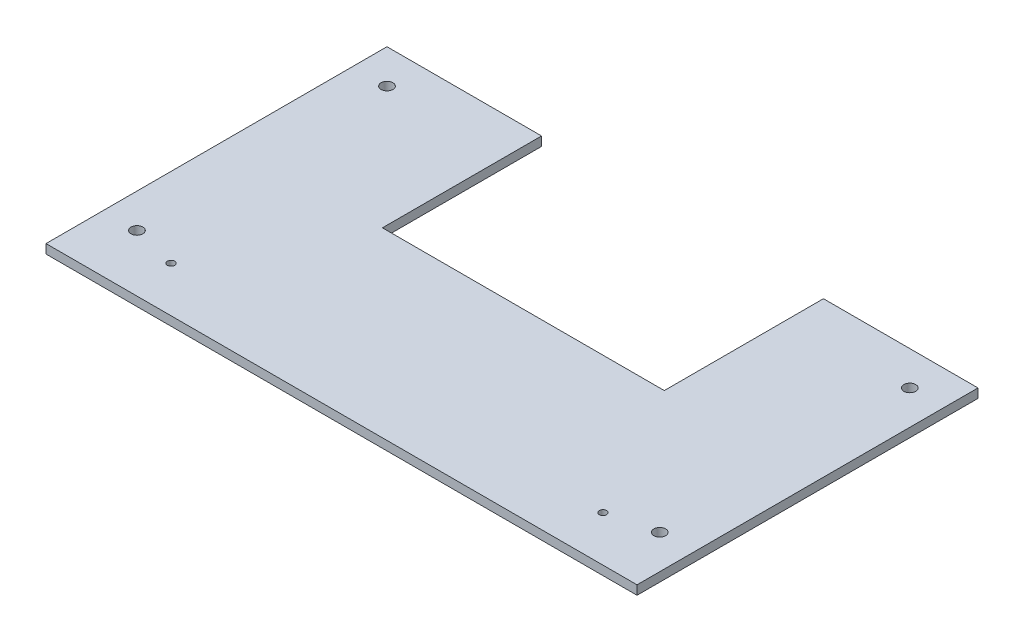
ISO-10303-21;
HEADER;
FILE_DESCRIPTION(('STEP AP214'),'2;1');
FILE_NAME('part.step','',(''),(''),'','','');
FILE_SCHEMA(('AUTOMOTIVE_DESIGN { 1 0 10303 214 1 1 1 1 }'));
ENDSEC;
DATA;
#1=APPLICATION_CONTEXT('core data for automotive mechanical design processes');
#2=APPLICATION_PROTOCOL_DEFINITION('international standard','automotive_design',2000,#1);
#3=PRODUCT_CONTEXT('',#1,'mechanical');
#4=PRODUCT('Part','Part','',(#3));
#5=PRODUCT_RELATED_PRODUCT_CATEGORY('part','',(#4));
#6=PRODUCT_DEFINITION_FORMATION('','',#4);
#7=PRODUCT_DEFINITION_CONTEXT('part definition',#1,'design');
#8=PRODUCT_DEFINITION('design','',#6,#7);
#9=PRODUCT_DEFINITION_SHAPE('','',#8);
#10=(LENGTH_UNIT() NAMED_UNIT(*) SI_UNIT(.MILLI.,.METRE.));
#11=(NAMED_UNIT(*) PLANE_ANGLE_UNIT() SI_UNIT($,.RADIAN.));
#12=(NAMED_UNIT(*) SI_UNIT($,.STERADIAN.) SOLID_ANGLE_UNIT());
#13=UNCERTAINTY_MEASURE_WITH_UNIT(LENGTH_MEASURE(1.E-05),#10,'distance_accuracy_value','');
#14=(GEOMETRIC_REPRESENTATION_CONTEXT(3) GLOBAL_UNCERTAINTY_ASSIGNED_CONTEXT((#13)) GLOBAL_UNIT_ASSIGNED_CONTEXT((#10,
#11,#12)) REPRESENTATION_CONTEXT('',''));
#15=CARTESIAN_POINT('',(0.,0.,0.));
#16=DIRECTION('',(0.,0.,1.));
#17=DIRECTION('',(1.,0.,0.));
#18=AXIS2_PLACEMENT_3D('',#15,#16,#17);
#19=CARTESIAN_POINT('',(-130.,4.,-75.));
#20=DIRECTION('',(0.,0.,1.));
#21=DIRECTION('',(1.,0.,0.));
#22=AXIS2_PLACEMENT_3D('',#19,#20,#21);
#23=PLANE('',#22);
#24=DIRECTION('',(-1.,0.,0.));
#25=VECTOR('',#24,1.);
#26=CARTESIAN_POINT('',(-130.,4.,-75.));
#27=LINE('',#26,#25);
#28=CARTESIAN_POINT('',(-62.,4.,-75.));
#29=VERTEX_POINT('',#28);
#30=CARTESIAN_POINT('',(-130.,4.,-75.));
#31=VERTEX_POINT('',#30);
#32=EDGE_CURVE('E174',#29,#31,#27,.T.);
#33=ORIENTED_EDGE('',*,*,#32,.F.);
#34=DIRECTION('',(0.,1.,0.));
#35=VECTOR('',#34,1.);
#36=CARTESIAN_POINT('',(-62.,0.,-75.));
#37=LINE('',#36,#35);
#38=CARTESIAN_POINT('',(-62.,0.,-75.));
#39=VERTEX_POINT('',#38);
#40=EDGE_CURVE('E162',#39,#29,#37,.T.);
#41=ORIENTED_EDGE('',*,*,#40,.F.);
#42=DIRECTION('',(-1.,0.,0.));
#43=VECTOR('',#42,1.);
#44=CARTESIAN_POINT('',(-130.,0.,-75.));
#45=LINE('',#44,#43);
#46=CARTESIAN_POINT('',(-130.,0.,-75.));
#47=VERTEX_POINT('',#46);
#48=EDGE_CURVE('E144',#39,#47,#45,.T.);
#49=ORIENTED_EDGE('',*,*,#48,.T.);
#50=DIRECTION('',(0.,-1.,0.));
#51=VECTOR('',#50,1.);
#52=CARTESIAN_POINT('',(-130.,4.,-75.));
#53=LINE('',#52,#51);
#54=EDGE_CURVE('E54',#31,#47,#53,.T.);
#55=ORIENTED_EDGE('',*,*,#54,.F.);
#56=EDGE_LOOP('',(#33,#41,#49,#55));
#57=FACE_BOUND('',#56,.T.);
#58=ADVANCED_FACE('F44',(#57),#23,.F.);
#59=CARTESIAN_POINT('',(130.,4.,75.));
#60=DIRECTION('',(-1.,0.,0.));
#61=DIRECTION('',(0.,0.,1.));
#62=AXIS2_PLACEMENT_3D('',#59,#60,#61);
#63=PLANE('',#62);
#64=DIRECTION('',(0.,0.,-1.));
#65=VECTOR('',#64,1.);
#66=CARTESIAN_POINT('',(130.,0.,75.));
#67=LINE('',#66,#65);
#68=CARTESIAN_POINT('',(130.,0.,75.));
#69=VERTEX_POINT('',#68);
#70=CARTESIAN_POINT('',(130.,0.,-75.));
#71=VERTEX_POINT('',#70);
#72=EDGE_CURVE('E165',#69,#71,#67,.T.);
#73=ORIENTED_EDGE('',*,*,#72,.T.);
#74=DIRECTION('',(0.,-1.,0.));
#75=VECTOR('',#74,1.);
#76=CARTESIAN_POINT('',(130.,4.,-75.));
#77=LINE('',#76,#75);
#78=CARTESIAN_POINT('',(130.,4.,-75.));
#79=VERTEX_POINT('',#78);
#80=EDGE_CURVE('E11',#79,#71,#77,.T.);
#81=ORIENTED_EDGE('',*,*,#80,.F.);
#82=DIRECTION('',(0.,0.,-1.));
#83=VECTOR('',#82,1.);
#84=CARTESIAN_POINT('',(130.,4.,75.));
#85=LINE('',#84,#83);
#86=CARTESIAN_POINT('',(130.,4.,75.));
#87=VERTEX_POINT('',#86);
#88=EDGE_CURVE('E171',#87,#79,#85,.T.);
#89=ORIENTED_EDGE('',*,*,#88,.F.);
#90=DIRECTION('',(0.,-1.,0.));
#91=VECTOR('',#90,1.);
#92=CARTESIAN_POINT('',(130.,4.,75.));
#93=LINE('',#92,#91);
#94=EDGE_CURVE('E182',#87,#69,#93,.T.);
#95=ORIENTED_EDGE('',*,*,#94,.T.);
#96=EDGE_LOOP('',(#73,#81,#89,#95));
#97=FACE_BOUND('',#96,.T.);
#98=ADVANCED_FACE('F46',(#97),#63,.F.);
#99=CARTESIAN_POINT('',(62.,0.,-75.));
#100=VERTEX_POINT('',#99);
#101=EDGE_CURVE('E186',#71,#100,#45,.T.);
#102=ORIENTED_EDGE('',*,*,#101,.T.);
#103=DIRECTION('',(0.,1.,0.));
#104=VECTOR('',#103,1.);
#105=CARTESIAN_POINT('',(62.,0.,-75.));
#106=LINE('',#105,#104);
#107=CARTESIAN_POINT('',(62.,4.,-75.));
#108=VERTEX_POINT('',#107);
#109=EDGE_CURVE('E166',#100,#108,#106,.T.);
#110=ORIENTED_EDGE('',*,*,#109,.T.);
#111=EDGE_CURVE('E99',#79,#108,#27,.T.);
#112=ORIENTED_EDGE('',*,*,#111,.F.);
#113=ORIENTED_EDGE('',*,*,#80,.T.);
#114=EDGE_LOOP('',(#102,#110,#112,#113));
#115=FACE_BOUND('',#114,.T.);
#116=ADVANCED_FACE('F271',(#115),#23,.F.);
#117=CARTESIAN_POINT('',(-130.,4.,75.));
#118=DIRECTION('',(1.,0.,0.));
#119=DIRECTION('',(0.,0.,-1.));
#120=AXIS2_PLACEMENT_3D('',#117,#118,#119);
#121=PLANE('',#120);
#122=DIRECTION('',(0.,0.,1.));
#123=VECTOR('',#122,1.);
#124=CARTESIAN_POINT('',(-130.,0.,75.));
#125=LINE('',#124,#123);
#126=CARTESIAN_POINT('',(-130.,0.,75.));
#127=VERTEX_POINT('',#126);
#128=EDGE_CURVE('E190',#47,#127,#125,.T.);
#129=ORIENTED_EDGE('',*,*,#128,.T.);
#130=DIRECTION('',(0.,-1.,0.));
#131=VECTOR('',#130,1.);
#132=CARTESIAN_POINT('',(-130.,4.,75.));
#133=LINE('',#132,#131);
#134=CARTESIAN_POINT('',(-130.,4.,75.));
#135=VERTEX_POINT('',#134);
#136=EDGE_CURVE('E197',#135,#127,#133,.T.);
#137=ORIENTED_EDGE('',*,*,#136,.F.);
#138=DIRECTION('',(0.,0.,1.));
#139=VECTOR('',#138,1.);
#140=CARTESIAN_POINT('',(-130.,4.,75.));
#141=LINE('',#140,#139);
#142=EDGE_CURVE('E177',#31,#135,#141,.T.);
#143=ORIENTED_EDGE('',*,*,#142,.F.);
#144=ORIENTED_EDGE('',*,*,#54,.T.);
#145=EDGE_LOOP('',(#129,#137,#143,#144));
#146=FACE_BOUND('',#145,.T.);
#147=ADVANCED_FACE('F280',(#146),#121,.F.);
#148=CARTESIAN_POINT('',(-130.,4.,75.));
#149=DIRECTION('',(0.,0.,-1.));
#150=DIRECTION('',(-1.,0.,0.));
#151=AXIS2_PLACEMENT_3D('',#148,#149,#150);
#152=PLANE('',#151);
#153=DIRECTION('',(1.,0.,0.));
#154=VECTOR('',#153,1.);
#155=CARTESIAN_POINT('',(-130.,0.,75.));
#156=LINE('',#155,#154);
#157=EDGE_CURVE('E92',#127,#69,#156,.T.);
#158=ORIENTED_EDGE('',*,*,#157,.T.);
#159=ORIENTED_EDGE('',*,*,#94,.F.);
#160=DIRECTION('',(1.,0.,0.));
#161=VECTOR('',#160,1.);
#162=CARTESIAN_POINT('',(-130.,4.,75.));
#163=LINE('',#162,#161);
#164=EDGE_CURVE('E71',#135,#87,#163,.T.);
#165=ORIENTED_EDGE('',*,*,#164,.F.);
#166=ORIENTED_EDGE('',*,*,#136,.T.);
#167=EDGE_LOOP('',(#158,#159,#165,#166));
#168=FACE_BOUND('',#167,.T.);
#169=ADVANCED_FACE('F285',(#168),#152,.F.);
#170=CARTESIAN_POINT('',(0.,4.,0.));
#171=DIRECTION('',(0.,-1.,0.));
#172=DIRECTION('',(0.,0.,-1.));
#173=AXIS2_PLACEMENT_3D('',#170,#171,#172);
#174=PLANE('',#173);
#175=CARTESIAN_POINT('',(94.9999999999999,4.,55.));
#176=DIRECTION('',(0.,1.,0.));
#177=DIRECTION('',(0.,0.,1.));
#178=AXIS2_PLACEMENT_3D('',#175,#176,#177);
#179=CIRCLE('',#178,1.60000000000001);
#180=CARTESIAN_POINT('',(94.9999999999999,4.,56.6));
#181=VERTEX_POINT('',#180);
#182=EDGE_CURVE('E205',#181,#181,#179,.T.);
#183=ORIENTED_EDGE('',*,*,#182,.F.);
#184=EDGE_LOOP('',(#183));
#185=FACE_BOUND('',#184,.T.);
#186=CARTESIAN_POINT('',(-95.0000000000001,4.,55.0000000000013));
#187=DIRECTION('',(0.,1.,0.));
#188=DIRECTION('',(0.,0.,1.));
#189=AXIS2_PLACEMENT_3D('',#186,#187,#188);
#190=CIRCLE('',#189,1.60000000000001);
#191=CARTESIAN_POINT('',(-95.0000000000001,4.,56.6000000000013));
#192=VERTEX_POINT('',#191);
#193=EDGE_CURVE('E212',#192,#192,#190,.T.);
#194=ORIENTED_EDGE('',*,*,#193,.F.);
#195=EDGE_LOOP('',(#194));
#196=FACE_BOUND('',#195,.T.);
#197=CARTESIAN_POINT('',(-114.999999999999,4.,50.));
#198=DIRECTION('',(0.,1.,0.));
#199=DIRECTION('',(0.,0.,1.));
#200=AXIS2_PLACEMENT_3D('',#197,#198,#199);
#201=CIRCLE('',#200,2.59999999999999);
#202=CARTESIAN_POINT('',(-114.999999999999,4.,52.6));
#203=VERTEX_POINT('',#202);
#204=EDGE_CURVE('E242',#203,#203,#201,.T.);
#205=ORIENTED_EDGE('',*,*,#204,.F.);
#206=EDGE_LOOP('',(#205));
#207=FACE_BOUND('',#206,.T.);
#208=CARTESIAN_POINT('',(115.000000000001,4.,50.));
#209=DIRECTION('',(0.,1.,0.));
#210=DIRECTION('',(0.,0.,1.));
#211=AXIS2_PLACEMENT_3D('',#208,#209,#210);
#212=CIRCLE('',#211,2.59999999999999);
#213=CARTESIAN_POINT('',(115.000000000001,4.,52.6));
#214=VERTEX_POINT('',#213);
#215=EDGE_CURVE('E235',#214,#214,#212,.T.);
#216=ORIENTED_EDGE('',*,*,#215,.F.);
#217=EDGE_LOOP('',(#216));
#218=FACE_BOUND('',#217,.T.);
#219=CARTESIAN_POINT('',(115.,4.,-60.));
#220=DIRECTION('',(0.,1.,0.));
#221=DIRECTION('',(0.,0.,1.));
#222=AXIS2_PLACEMENT_3D('',#219,#220,#221);
#223=CIRCLE('',#222,2.59999999999999);
#224=CARTESIAN_POINT('',(115.,4.,-57.4));
#225=VERTEX_POINT('',#224);
#226=EDGE_CURVE('E227',#225,#225,#223,.T.);
#227=ORIENTED_EDGE('',*,*,#226,.F.);
#228=EDGE_LOOP('',(#227));
#229=FACE_BOUND('',#228,.T.);
#230=CARTESIAN_POINT('',(-115.,4.,-60.));
#231=DIRECTION('',(0.,1.,0.));
#232=DIRECTION('',(0.,0.,1.));
#233=AXIS2_PLACEMENT_3D('',#230,#231,#232);
#234=CIRCLE('',#233,2.59999999999999);
#235=CARTESIAN_POINT('',(-115.,4.,-57.4));
#236=VERTEX_POINT('',#235);
#237=EDGE_CURVE('E159',#236,#236,#234,.T.);
#238=ORIENTED_EDGE('',*,*,#237,.F.);
#239=EDGE_LOOP('',(#238));
#240=FACE_BOUND('',#239,.T.);
#241=DIRECTION('',(1.,0.,0.));
#242=VECTOR('',#241,1.);
#243=CARTESIAN_POINT('',(-62.,4.,-4.99999999999999));
#244=LINE('',#243,#242);
#245=CARTESIAN_POINT('',(-62.,4.,-4.99999999999999));
#246=VERTEX_POINT('',#245);
#247=CARTESIAN_POINT('',(62.,4.,-4.99999999999999));
#248=VERTEX_POINT('',#247);
#249=EDGE_CURVE('E149',#246,#248,#244,.T.);
#250=ORIENTED_EDGE('',*,*,#249,.F.);
#251=DIRECTION('',(0.,0.,1.));
#252=VECTOR('',#251,1.);
#253=CARTESIAN_POINT('',(-62.,4.,-4.99999999999999));
#254=LINE('',#253,#252);
#255=EDGE_CURVE('E128',#29,#246,#254,.T.);
#256=ORIENTED_EDGE('',*,*,#255,.F.);
#257=ORIENTED_EDGE('',*,*,#32,.T.);
#258=ORIENTED_EDGE('',*,*,#142,.T.);
#259=ORIENTED_EDGE('',*,*,#164,.T.);
#260=ORIENTED_EDGE('',*,*,#88,.T.);
#261=ORIENTED_EDGE('',*,*,#111,.T.);
#262=DIRECTION('',(0.,0.,-1.));
#263=VECTOR('',#262,1.);
#264=CARTESIAN_POINT('',(62.,4.,-4.99999999999999));
#265=LINE('',#264,#263);
#266=EDGE_CURVE('E146',#248,#108,#265,.T.);
#267=ORIENTED_EDGE('',*,*,#266,.F.);
#268=EDGE_LOOP('',(#250,#256,#257,#258,#259,#260,#261,#267));
#269=FACE_BOUND('',#268,.T.);
#270=ADVANCED_FACE('F295',(#185,#196,#207,#218,#229,#240,#269),#174,.F.);
#271=CARTESIAN_POINT('',(0.,0.,0.));
#272=DIRECTION('',(0.,-1.,0.));
#273=DIRECTION('',(0.,0.,-1.));
#274=AXIS2_PLACEMENT_3D('',#271,#272,#273);
#275=PLANE('',#274);
#276=CARTESIAN_POINT('',(94.9999999999999,0.,55.));
#277=DIRECTION('',(0.,-1.,0.));
#278=DIRECTION('',(0.,0.,-1.));
#279=AXIS2_PLACEMENT_3D('',#276,#277,#278);
#280=CIRCLE('',#279,1.60000000000001);
#281=CARTESIAN_POINT('',(94.9999999999999,0.,53.4));
#282=VERTEX_POINT('',#281);
#283=EDGE_CURVE('E48',#282,#282,#280,.T.);
#284=ORIENTED_EDGE('',*,*,#283,.F.);
#285=EDGE_LOOP('',(#284));
#286=FACE_BOUND('',#285,.T.);
#287=CARTESIAN_POINT('',(-95.0000000000001,0.,55.0000000000013));
#288=DIRECTION('',(0.,-1.,0.));
#289=DIRECTION('',(0.,0.,-1.));
#290=AXIS2_PLACEMENT_3D('',#287,#288,#289);
#291=CIRCLE('',#290,1.60000000000001);
#292=CARTESIAN_POINT('',(-95.0000000000001,0.,53.4000000000013));
#293=VERTEX_POINT('',#292);
#294=EDGE_CURVE('E202',#293,#293,#291,.T.);
#295=ORIENTED_EDGE('',*,*,#294,.F.);
#296=EDGE_LOOP('',(#295));
#297=FACE_BOUND('',#296,.T.);
#298=CARTESIAN_POINT('',(-114.999999999999,0.,50.));
#299=DIRECTION('',(0.,1.,0.));
#300=DIRECTION('',(0.,0.,1.));
#301=AXIS2_PLACEMENT_3D('',#298,#299,#300);
#302=CIRCLE('',#301,2.59999999999999);
#303=CARTESIAN_POINT('',(-114.999999999999,0.,52.6));
#304=VERTEX_POINT('',#303);
#305=EDGE_CURVE('E152',#304,#304,#302,.T.);
#306=ORIENTED_EDGE('',*,*,#305,.T.);
#307=EDGE_LOOP('',(#306));
#308=FACE_BOUND('',#307,.T.);
#309=CARTESIAN_POINT('',(115.000000000001,0.,50.));
#310=DIRECTION('',(0.,1.,0.));
#311=DIRECTION('',(0.,0.,1.));
#312=AXIS2_PLACEMENT_3D('',#309,#310,#311);
#313=CIRCLE('',#312,2.59999999999999);
#314=CARTESIAN_POINT('',(115.000000000001,0.,52.6));
#315=VERTEX_POINT('',#314);
#316=EDGE_CURVE('E239',#315,#315,#313,.T.);
#317=ORIENTED_EDGE('',*,*,#316,.T.);
#318=EDGE_LOOP('',(#317));
#319=FACE_BOUND('',#318,.T.);
#320=CARTESIAN_POINT('',(115.,0.,-60.));
#321=DIRECTION('',(0.,1.,0.));
#322=DIRECTION('',(0.,0.,1.));
#323=AXIS2_PLACEMENT_3D('',#320,#321,#322);
#324=CIRCLE('',#323,2.59999999999999);
#325=CARTESIAN_POINT('',(115.,0.,-57.4));
#326=VERTEX_POINT('',#325);
#327=EDGE_CURVE('E231',#326,#326,#324,.T.);
#328=ORIENTED_EDGE('',*,*,#327,.T.);
#329=EDGE_LOOP('',(#328));
#330=FACE_BOUND('',#329,.T.);
#331=CARTESIAN_POINT('',(-115.,0.,-60.));
#332=DIRECTION('',(0.,1.,0.));
#333=DIRECTION('',(0.,0.,1.));
#334=AXIS2_PLACEMENT_3D('',#331,#332,#333);
#335=CIRCLE('',#334,2.59999999999999);
#336=CARTESIAN_POINT('',(-115.,0.,-57.4));
#337=VERTEX_POINT('',#336);
#338=EDGE_CURVE('E223',#337,#337,#335,.T.);
#339=ORIENTED_EDGE('',*,*,#338,.T.);
#340=EDGE_LOOP('',(#339));
#341=FACE_BOUND('',#340,.T.);
#342=DIRECTION('',(0.,0.,1.));
#343=VECTOR('',#342,1.);
#344=CARTESIAN_POINT('',(-62.,0.,-4.99999999999999));
#345=LINE('',#344,#343);
#346=CARTESIAN_POINT('',(-62.,0.,-4.99999999999999));
#347=VERTEX_POINT('',#346);
#348=EDGE_CURVE('E125',#39,#347,#345,.T.);
#349=ORIENTED_EDGE('',*,*,#348,.T.);
#350=DIRECTION('',(1.,0.,0.));
#351=VECTOR('',#350,1.);
#352=CARTESIAN_POINT('',(-62.,0.,-4.99999999999999));
#353=LINE('',#352,#351);
#354=CARTESIAN_POINT('',(62.,0.,-4.99999999999999));
#355=VERTEX_POINT('',#354);
#356=EDGE_CURVE('E136',#347,#355,#353,.T.);
#357=ORIENTED_EDGE('',*,*,#356,.T.);
#358=DIRECTION('',(0.,0.,-1.));
#359=VECTOR('',#358,1.);
#360=CARTESIAN_POINT('',(62.,0.,-4.99999999999999));
#361=LINE('',#360,#359);
#362=EDGE_CURVE('E62',#355,#100,#361,.T.);
#363=ORIENTED_EDGE('',*,*,#362,.T.);
#364=ORIENTED_EDGE('',*,*,#101,.F.);
#365=ORIENTED_EDGE('',*,*,#72,.F.);
#366=ORIENTED_EDGE('',*,*,#157,.F.);
#367=ORIENTED_EDGE('',*,*,#128,.F.);
#368=ORIENTED_EDGE('',*,*,#48,.F.);
#369=EDGE_LOOP('',(#349,#357,#363,#364,#365,#366,#367,#368));
#370=FACE_BOUND('',#369,.T.);
#371=ADVANCED_FACE('F142',(#286,#297,#308,#319,#330,#341,#370),#275,.T.);
#372=CARTESIAN_POINT('',(-62.,0.,-4.99999999999999));
#373=DIRECTION('',(-1.,0.,0.));
#374=DIRECTION('',(0.,0.,1.));
#375=AXIS2_PLACEMENT_3D('',#372,#373,#374);
#376=PLANE('',#375);
#377=ORIENTED_EDGE('',*,*,#255,.T.);
#378=DIRECTION('',(0.,1.,0.));
#379=VECTOR('',#378,1.);
#380=CARTESIAN_POINT('',(-62.,0.,-4.99999999999999));
#381=LINE('',#380,#379);
#382=EDGE_CURVE('E121',#347,#246,#381,.T.);
#383=ORIENTED_EDGE('',*,*,#382,.F.);
#384=ORIENTED_EDGE('',*,*,#348,.F.);
#385=ORIENTED_EDGE('',*,*,#40,.T.);
#386=EDGE_LOOP('',(#377,#383,#384,#385));
#387=FACE_BOUND('',#386,.T.);
#388=ADVANCED_FACE('F123',(#387),#376,.F.);
#389=CARTESIAN_POINT('',(62.,0.,-4.99999999999999));
#390=DIRECTION('',(1.,0.,0.));
#391=DIRECTION('',(0.,0.,-1.));
#392=AXIS2_PLACEMENT_3D('',#389,#390,#391);
#393=PLANE('',#392);
#394=ORIENTED_EDGE('',*,*,#266,.T.);
#395=ORIENTED_EDGE('',*,*,#109,.F.);
#396=ORIENTED_EDGE('',*,*,#362,.F.);
#397=DIRECTION('',(0.,1.,0.));
#398=VECTOR('',#397,1.);
#399=CARTESIAN_POINT('',(62.,0.,-4.99999999999999));
#400=LINE('',#399,#398);
#401=EDGE_CURVE('E133',#355,#248,#400,.T.);
#402=ORIENTED_EDGE('',*,*,#401,.T.);
#403=EDGE_LOOP('',(#394,#395,#396,#402));
#404=FACE_BOUND('',#403,.T.);
#405=ADVANCED_FACE('F297',(#404),#393,.F.);
#406=CARTESIAN_POINT('',(-62.,0.,-4.99999999999999));
#407=DIRECTION('',(0.,0.,1.));
#408=DIRECTION('',(1.,0.,0.));
#409=AXIS2_PLACEMENT_3D('',#406,#407,#408);
#410=PLANE('',#409);
#411=ORIENTED_EDGE('',*,*,#249,.T.);
#412=ORIENTED_EDGE('',*,*,#401,.F.);
#413=ORIENTED_EDGE('',*,*,#356,.F.);
#414=ORIENTED_EDGE('',*,*,#382,.T.);
#415=EDGE_LOOP('',(#411,#412,#413,#414));
#416=FACE_BOUND('',#415,.T.);
#417=ADVANCED_FACE('F137',(#416),#410,.F.);
#418=CARTESIAN_POINT('',(-115.,0.,-60.));
#419=DIRECTION('',(0.,1.,0.));
#420=DIRECTION('',(0.,0.,1.));
#421=AXIS2_PLACEMENT_3D('',#418,#419,#420);
#422=CYLINDRICAL_SURFACE('',#421,2.59999999999999);
#423=ORIENTED_EDGE('',*,*,#338,.F.);
#424=EDGE_LOOP('',(#423));
#425=FACE_BOUND('',#424,.T.);
#426=ORIENTED_EDGE('',*,*,#237,.T.);
#427=EDGE_LOOP('',(#426));
#428=FACE_BOUND('',#427,.T.);
#429=ADVANCED_FACE('F302',(#425,#428),#422,.F.);
#430=CARTESIAN_POINT('',(115.,0.,-60.));
#431=DIRECTION('',(0.,1.,0.));
#432=DIRECTION('',(0.,0.,1.));
#433=AXIS2_PLACEMENT_3D('',#430,#431,#432);
#434=CYLINDRICAL_SURFACE('',#433,2.59999999999999);
#435=ORIENTED_EDGE('',*,*,#327,.F.);
#436=EDGE_LOOP('',(#435));
#437=FACE_BOUND('',#436,.T.);
#438=ORIENTED_EDGE('',*,*,#226,.T.);
#439=EDGE_LOOP('',(#438));
#440=FACE_BOUND('',#439,.T.);
#441=ADVANCED_FACE('F265',(#437,#440),#434,.F.);
#442=CARTESIAN_POINT('',(115.000000000001,0.,50.));
#443=DIRECTION('',(0.,1.,0.));
#444=DIRECTION('',(0.,0.,1.));
#445=AXIS2_PLACEMENT_3D('',#442,#443,#444);
#446=CYLINDRICAL_SURFACE('',#445,2.59999999999999);
#447=ORIENTED_EDGE('',*,*,#316,.F.);
#448=EDGE_LOOP('',(#447));
#449=FACE_BOUND('',#448,.T.);
#450=ORIENTED_EDGE('',*,*,#215,.T.);
#451=EDGE_LOOP('',(#450));
#452=FACE_BOUND('',#451,.T.);
#453=ADVANCED_FACE('F256',(#449,#452),#446,.F.);
#454=CARTESIAN_POINT('',(-114.999999999999,0.,50.));
#455=DIRECTION('',(0.,1.,0.));
#456=DIRECTION('',(0.,0.,1.));
#457=AXIS2_PLACEMENT_3D('',#454,#455,#456);
#458=CYLINDRICAL_SURFACE('',#457,2.59999999999999);
#459=ORIENTED_EDGE('',*,*,#305,.F.);
#460=EDGE_LOOP('',(#459));
#461=FACE_BOUND('',#460,.T.);
#462=ORIENTED_EDGE('',*,*,#204,.T.);
#463=EDGE_LOOP('',(#462));
#464=FACE_BOUND('',#463,.T.);
#465=ADVANCED_FACE('F253',(#461,#464),#458,.F.);
#466=CARTESIAN_POINT('',(-95.0000000000001,-6.,55.0000000000013));
#467=DIRECTION('',(0.,1.,0.));
#468=DIRECTION('',(0.,0.,1.));
#469=AXIS2_PLACEMENT_3D('',#466,#467,#468);
#470=CYLINDRICAL_SURFACE('',#469,1.60000000000001);
#471=ORIENTED_EDGE('',*,*,#294,.T.);
#472=EDGE_LOOP('',(#471));
#473=FACE_BOUND('',#472,.T.);
#474=ORIENTED_EDGE('',*,*,#193,.T.);
#475=EDGE_LOOP('',(#474));
#476=FACE_BOUND('',#475,.T.);
#477=ADVANCED_FACE('F255',(#473,#476),#470,.F.);
#478=CARTESIAN_POINT('',(94.9999999999999,-6.,55.));
#479=DIRECTION('',(0.,1.,0.));
#480=DIRECTION('',(0.,0.,1.));
#481=AXIS2_PLACEMENT_3D('',#478,#479,#480);
#482=CYLINDRICAL_SURFACE('',#481,1.60000000000001);
#483=ORIENTED_EDGE('',*,*,#283,.T.);
#484=EDGE_LOOP('',(#483));
#485=FACE_BOUND('',#484,.T.);
#486=ORIENTED_EDGE('',*,*,#182,.T.);
#487=EDGE_LOOP('',(#486));
#488=FACE_BOUND('',#487,.T.);
#489=ADVANCED_FACE('F263',(#485,#488),#482,.F.);
#490=CLOSED_SHELL('',(#58,#98,#116,#147,#169,#270,#371,#388,#405,#417,#429,#441,#453,#465,#477,#489));
#491=MANIFOLD_SOLID_BREP('B2',#490);
#492=ADVANCED_BREP_SHAPE_REPRESENTATION('',(#18,#491),#14);
#493=SHAPE_DEFINITION_REPRESENTATION(#9,#492);
ENDSEC;
END-ISO-10303-21;
